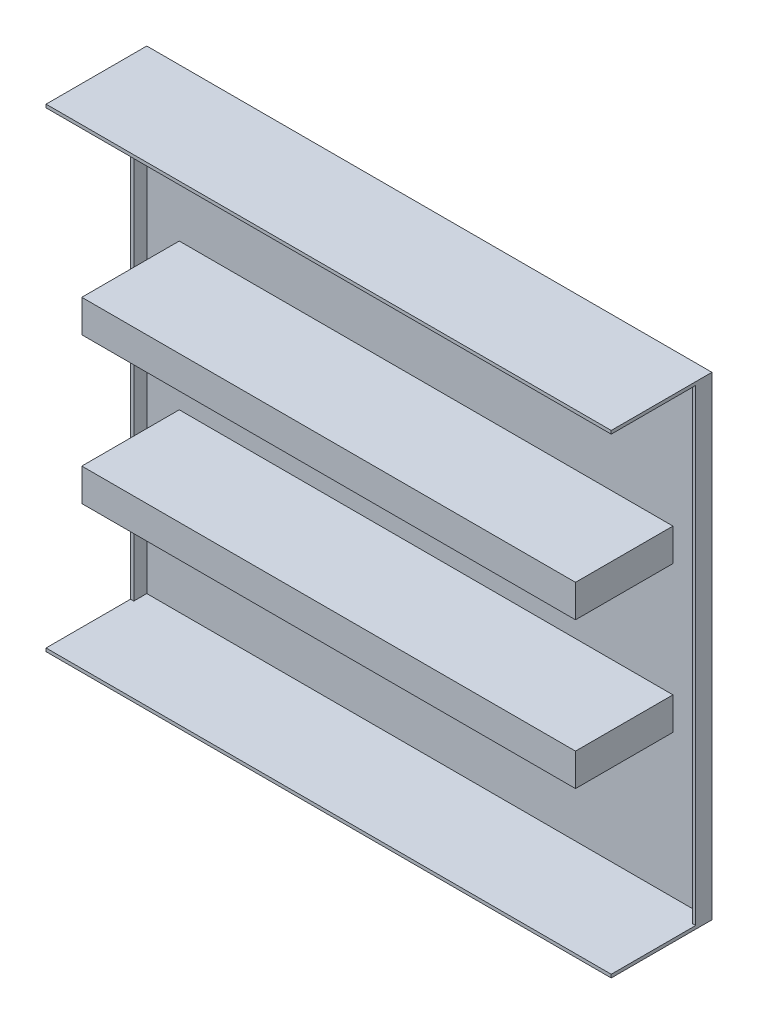
ISO-10303-21;
HEADER;
FILE_DESCRIPTION(('STEP AP214'),'2;1');
FILE_NAME('part.step','',(''),(''),'','','');
FILE_SCHEMA(('AUTOMOTIVE_DESIGN { 1 0 10303 214 1 1 1 1 }'));
ENDSEC;
DATA;
#1=APPLICATION_CONTEXT('core data for automotive mechanical design processes');
#2=APPLICATION_PROTOCOL_DEFINITION('international standard','automotive_design',2000,#1);
#3=PRODUCT_CONTEXT('',#1,'mechanical');
#4=PRODUCT('Part','Part','',(#3));
#5=PRODUCT_RELATED_PRODUCT_CATEGORY('part','',(#4));
#6=PRODUCT_DEFINITION_FORMATION('','',#4);
#7=PRODUCT_DEFINITION_CONTEXT('part definition',#1,'design');
#8=PRODUCT_DEFINITION('design','',#6,#7);
#9=PRODUCT_DEFINITION_SHAPE('','',#8);
#10=(LENGTH_UNIT() NAMED_UNIT(*) SI_UNIT(.MILLI.,.METRE.));
#11=(NAMED_UNIT(*) PLANE_ANGLE_UNIT() SI_UNIT($,.RADIAN.));
#12=(NAMED_UNIT(*) SI_UNIT($,.STERADIAN.) SOLID_ANGLE_UNIT());
#13=UNCERTAINTY_MEASURE_WITH_UNIT(LENGTH_MEASURE(1.E-05),#10,'distance_accuracy_value','');
#14=(GEOMETRIC_REPRESENTATION_CONTEXT(3) GLOBAL_UNCERTAINTY_ASSIGNED_CONTEXT((#13)) GLOBAL_UNIT_ASSIGNED_CONTEXT((#10,
#11,#12)) REPRESENTATION_CONTEXT('',''));
#15=CARTESIAN_POINT('',(0.,0.,0.));
#16=DIRECTION('',(0.,0.,1.));
#17=DIRECTION('',(1.,0.,0.));
#18=AXIS2_PLACEMENT_3D('',#15,#16,#17);
#19=CARTESIAN_POINT('',(0.,0.,5.));
#20=DIRECTION('',(0.,0.,1.));
#21=DIRECTION('',(1.,0.,0.));
#22=AXIS2_PLACEMENT_3D('',#19,#20,#21);
#23=PLANE('',#22);
#24=DIRECTION('',(0.,-1.,0.));
#25=VECTOR('',#24,1.);
#26=CARTESIAN_POINT('',(173.,145.,5.));
#27=LINE('',#26,#25);
#28=CARTESIAN_POINT('',(173.,144.,5.));
#29=VERTEX_POINT('',#28);
#30=CARTESIAN_POINT('',(173.,0.,5.));
#31=VERTEX_POINT('',#30);
#32=EDGE_CURVE('E87',#29,#31,#27,.T.);
#33=ORIENTED_EDGE('',*,*,#32,.F.);
#34=DIRECTION('',(-1.,0.,0.));
#35=VECTOR('',#34,1.);
#36=CARTESIAN_POINT('',(0.,144.,5.));
#37=LINE('',#36,#35);
#38=CARTESIAN_POINT('',(172.,144.,5.));
#39=VERTEX_POINT('',#38);
#40=EDGE_CURVE('E12',#29,#39,#37,.T.);
#41=ORIENTED_EDGE('',*,*,#40,.T.);
#42=DIRECTION('',(0.,1.,0.));
#43=VECTOR('',#42,1.);
#44=CARTESIAN_POINT('',(172.,0.,5.));
#45=LINE('',#44,#43);
#46=CARTESIAN_POINT('',(172.,0.,5.));
#47=VERTEX_POINT('',#46);
#48=EDGE_CURVE('E425',#47,#39,#45,.T.);
#49=ORIENTED_EDGE('',*,*,#48,.F.);
#50=DIRECTION('',(-1.,0.,0.));
#51=VECTOR('',#50,1.);
#52=CARTESIAN_POINT('',(-1.,0.,5.));
#53=LINE('',#52,#51);
#54=EDGE_CURVE('E229',#31,#47,#53,.T.);
#55=ORIENTED_EDGE('',*,*,#54,.F.);
#56=EDGE_LOOP('',(#33,#41,#49,#55));
#57=FACE_BOUND('',#56,.T.);
#58=ADVANCED_FACE('F71',(#57),#23,.T.);
#59=DIRECTION('',(0.,1.,0.));
#60=VECTOR('',#59,1.);
#61=CARTESIAN_POINT('',(0.,0.,5.));
#62=LINE('',#61,#60);
#63=CARTESIAN_POINT('',(0.,0.,5.));
#64=VERTEX_POINT('',#63);
#65=CARTESIAN_POINT('',(0.,144.,5.));
#66=VERTEX_POINT('',#65);
#67=EDGE_CURVE('E421',#64,#66,#62,.T.);
#68=ORIENTED_EDGE('',*,*,#67,.T.);
#69=DIRECTION('',(1.,0.,0.));
#70=VECTOR('',#69,1.);
#71=CARTESIAN_POINT('',(-1.,144.,5.));
#72=LINE('',#71,#70);
#73=CARTESIAN_POINT('',(-1.,144.,5.));
#74=VERTEX_POINT('',#73);
#75=EDGE_CURVE('E293',#74,#66,#72,.T.);
#76=ORIENTED_EDGE('',*,*,#75,.F.);
#77=DIRECTION('',(0.,-1.,0.));
#78=VECTOR('',#77,1.);
#79=CARTESIAN_POINT('',(-1.,145.,5.));
#80=LINE('',#79,#78);
#81=CARTESIAN_POINT('',(-1.,0.,5.));
#82=VERTEX_POINT('',#81);
#83=EDGE_CURVE('E233',#74,#82,#80,.T.);
#84=ORIENTED_EDGE('',*,*,#83,.T.);
#85=EDGE_CURVE('E80',#64,#82,#53,.T.);
#86=ORIENTED_EDGE('',*,*,#85,.F.);
#87=EDGE_LOOP('',(#68,#76,#84,#86));
#88=FACE_BOUND('',#87,.T.);
#89=ADVANCED_FACE('F441',(#88),#23,.T.);
#90=CARTESIAN_POINT('',(0.,0.,1.));
#91=DIRECTION('',(0.,0.,-1.));
#92=DIRECTION('',(-1.,0.,0.));
#93=AXIS2_PLACEMENT_3D('',#90,#91,#92);
#94=PLANE('',#93);
#95=DIRECTION('',(0.,1.,0.));
#96=VECTOR('',#95,1.);
#97=CARTESIAN_POINT('',(10.,44.,1.));
#98=LINE('',#97,#96);
#99=CARTESIAN_POINT('',(10.,44.,1.));
#100=VERTEX_POINT('',#99);
#101=CARTESIAN_POINT('',(10.,54.,1.));
#102=VERTEX_POINT('',#101);
#103=EDGE_CURVE('E95',#100,#102,#98,.T.);
#104=ORIENTED_EDGE('',*,*,#103,.T.);
#105=DIRECTION('',(1.,0.,0.));
#106=VECTOR('',#105,1.);
#107=CARTESIAN_POINT('',(10.,54.,1.));
#108=LINE('',#107,#106);
#109=CARTESIAN_POINT('',(162.,54.,1.));
#110=VERTEX_POINT('',#109);
#111=EDGE_CURVE('E362',#102,#110,#108,.T.);
#112=ORIENTED_EDGE('',*,*,#111,.T.);
#113=DIRECTION('',(0.,1.,0.));
#114=VECTOR('',#113,1.);
#115=CARTESIAN_POINT('',(162.,44.,1.));
#116=LINE('',#115,#114);
#117=CARTESIAN_POINT('',(162.,44.,1.));
#118=VERTEX_POINT('',#117);
#119=EDGE_CURVE('E358',#118,#110,#116,.T.);
#120=ORIENTED_EDGE('',*,*,#119,.F.);
#121=DIRECTION('',(1.,0.,0.));
#122=VECTOR('',#121,1.);
#123=CARTESIAN_POINT('',(10.,44.,1.));
#124=LINE('',#123,#122);
#125=EDGE_CURVE('E353',#100,#118,#124,.T.);
#126=ORIENTED_EDGE('',*,*,#125,.F.);
#127=EDGE_LOOP('',(#104,#112,#120,#126));
#128=FACE_BOUND('',#127,.T.);
#129=DIRECTION('',(1.,0.,0.));
#130=VECTOR('',#129,1.);
#131=CARTESIAN_POINT('',(0.,99.,1.));
#132=LINE('',#131,#130);
#133=CARTESIAN_POINT('',(10.,99.,1.));
#134=VERTEX_POINT('',#133);
#135=CARTESIAN_POINT('',(162.,99.,1.));
#136=VERTEX_POINT('',#135);
#137=EDGE_CURVE('E396',#134,#136,#132,.T.);
#138=ORIENTED_EDGE('',*,*,#137,.T.);
#139=DIRECTION('',(0.,-1.,0.));
#140=VECTOR('',#139,1.);
#141=CARTESIAN_POINT('',(162.,0.,1.));
#142=LINE('',#141,#140);
#143=CARTESIAN_POINT('',(162.,89.,1.));
#144=VERTEX_POINT('',#143);
#145=EDGE_CURVE('E365',#136,#144,#142,.T.);
#146=ORIENTED_EDGE('',*,*,#145,.T.);
#147=DIRECTION('',(1.,0.,0.));
#148=VECTOR('',#147,1.);
#149=CARTESIAN_POINT('',(0.,89.,1.));
#150=LINE('',#149,#148);
#151=CARTESIAN_POINT('',(10.,89.,1.));
#152=VERTEX_POINT('',#151);
#153=EDGE_CURVE('E383',#152,#144,#150,.T.);
#154=ORIENTED_EDGE('',*,*,#153,.F.);
#155=DIRECTION('',(0.,-1.,0.));
#156=VECTOR('',#155,1.);
#157=CARTESIAN_POINT('',(10.,0.,1.));
#158=LINE('',#157,#156);
#159=EDGE_CURVE('E399',#134,#152,#158,.T.);
#160=ORIENTED_EDGE('',*,*,#159,.F.);
#161=EDGE_LOOP('',(#138,#146,#154,#160));
#162=FACE_BOUND('',#161,.T.);
#163=DIRECTION('',(0.,1.,0.));
#164=VECTOR('',#163,1.);
#165=CARTESIAN_POINT('',(0.,0.,1.));
#166=LINE('',#165,#164);
#167=CARTESIAN_POINT('',(0.,0.,1.));
#168=VERTEX_POINT('',#167);
#169=CARTESIAN_POINT('',(0.,144.,1.));
#170=VERTEX_POINT('',#169);
#171=EDGE_CURVE('E268',#168,#170,#166,.T.);
#172=ORIENTED_EDGE('',*,*,#171,.F.);
#173=DIRECTION('',(1.,0.,0.));
#174=VECTOR('',#173,1.);
#175=CARTESIAN_POINT('',(0.,0.,1.));
#176=LINE('',#175,#174);
#177=CARTESIAN_POINT('',(172.,0.,1.));
#178=VERTEX_POINT('',#177);
#179=EDGE_CURVE('E277',#168,#178,#176,.T.);
#180=ORIENTED_EDGE('',*,*,#179,.T.);
#181=DIRECTION('',(0.,1.,0.));
#182=VECTOR('',#181,1.);
#183=CARTESIAN_POINT('',(172.,0.,1.));
#184=LINE('',#183,#182);
#185=CARTESIAN_POINT('',(172.,144.,1.));
#186=VERTEX_POINT('',#185);
#187=EDGE_CURVE('E275',#178,#186,#184,.T.);
#188=ORIENTED_EDGE('',*,*,#187,.T.);
#189=DIRECTION('',(1.,0.,0.));
#190=VECTOR('',#189,1.);
#191=CARTESIAN_POINT('',(0.,144.,1.));
#192=LINE('',#191,#190);
#193=EDGE_CURVE('E272',#170,#186,#192,.T.);
#194=ORIENTED_EDGE('',*,*,#193,.F.);
#195=EDGE_LOOP('',(#172,#180,#188,#194));
#196=FACE_BOUND('',#195,.T.);
#197=ADVANCED_FACE('F445',(#128,#162,#196),#94,.F.);
#198=CARTESIAN_POINT('',(0.,0.,5.));
#199=DIRECTION('',(-1.,0.,0.));
#200=DIRECTION('',(0.,0.,1.));
#201=AXIS2_PLACEMENT_3D('',#198,#199,#200);
#202=PLANE('',#201);
#203=DIRECTION('',(0.,0.,-1.));
#204=VECTOR('',#203,1.);
#205=CARTESIAN_POINT('',(0.,0.,5.));
#206=LINE('',#205,#204);
#207=EDGE_CURVE('E248',#64,#168,#206,.T.);
#208=ORIENTED_EDGE('',*,*,#207,.T.);
#209=ORIENTED_EDGE('',*,*,#171,.T.);
#210=DIRECTION('',(0.,0.,-1.));
#211=VECTOR('',#210,1.);
#212=CARTESIAN_POINT('',(0.,144.,5.));
#213=LINE('',#212,#211);
#214=EDGE_CURVE('E428',#66,#170,#213,.T.);
#215=ORIENTED_EDGE('',*,*,#214,.F.);
#216=ORIENTED_EDGE('',*,*,#67,.F.);
#217=EDGE_LOOP('',(#208,#209,#215,#216));
#218=FACE_BOUND('',#217,.T.);
#219=ADVANCED_FACE('F439',(#218),#202,.F.);
#220=CARTESIAN_POINT('',(0.,0.,5.));
#221=DIRECTION('',(0.,1.,0.));
#222=DIRECTION('',(0.,0.,1.));
#223=AXIS2_PLACEMENT_3D('',#220,#221,#222);
#224=PLANE('',#223);
#225=ORIENTED_EDGE('',*,*,#179,.F.);
#226=ORIENTED_EDGE('',*,*,#207,.F.);
#227=ORIENTED_EDGE('',*,*,#85,.T.);
#228=DIRECTION('',(0.,0.,-1.));
#229=VECTOR('',#228,1.);
#230=CARTESIAN_POINT('',(-1.,0.,31.));
#231=LINE('',#230,#229);
#232=CARTESIAN_POINT('',(-1.,0.,31.));
#233=VERTEX_POINT('',#232);
#234=EDGE_CURVE('E324',#233,#82,#231,.T.);
#235=ORIENTED_EDGE('',*,*,#234,.F.);
#236=DIRECTION('',(-1.,0.,0.));
#237=VECTOR('',#236,1.);
#238=CARTESIAN_POINT('',(-1.,0.,31.));
#239=LINE('',#238,#237);
#240=CARTESIAN_POINT('',(173.,0.,31.));
#241=VERTEX_POINT('',#240);
#242=EDGE_CURVE('E322',#241,#233,#239,.T.);
#243=ORIENTED_EDGE('',*,*,#242,.F.);
#244=DIRECTION('',(0.,0.,-1.));
#245=VECTOR('',#244,1.);
#246=CARTESIAN_POINT('',(173.,0.,31.));
#247=LINE('',#246,#245);
#248=EDGE_CURVE('E328',#241,#31,#247,.T.);
#249=ORIENTED_EDGE('',*,*,#248,.T.);
#250=ORIENTED_EDGE('',*,*,#54,.T.);
#251=DIRECTION('',(0.,0.,-1.));
#252=VECTOR('',#251,1.);
#253=CARTESIAN_POINT('',(172.,0.,5.));
#254=LINE('',#253,#252);
#255=EDGE_CURVE('E432',#47,#178,#254,.T.);
#256=ORIENTED_EDGE('',*,*,#255,.T.);
#257=EDGE_LOOP('',(#225,#226,#227,#235,#243,#249,#250,#256));
#258=FACE_BOUND('',#257,.T.);
#259=ADVANCED_FACE('F442',(#258),#224,.T.);
#260=CARTESIAN_POINT('',(172.,0.,5.));
#261=DIRECTION('',(-1.,0.,0.));
#262=DIRECTION('',(0.,0.,1.));
#263=AXIS2_PLACEMENT_3D('',#260,#261,#262);
#264=PLANE('',#263);
#265=ORIENTED_EDGE('',*,*,#187,.F.);
#266=ORIENTED_EDGE('',*,*,#255,.F.);
#267=ORIENTED_EDGE('',*,*,#48,.T.);
#268=DIRECTION('',(0.,0.,-1.));
#269=VECTOR('',#268,1.);
#270=CARTESIAN_POINT('',(172.,144.,5.));
#271=LINE('',#270,#269);
#272=EDGE_CURVE('E216',#39,#186,#271,.T.);
#273=ORIENTED_EDGE('',*,*,#272,.T.);
#274=EDGE_LOOP('',(#265,#266,#267,#273));
#275=FACE_BOUND('',#274,.T.);
#276=ADVANCED_FACE('F444',(#275),#264,.T.);
#277=CARTESIAN_POINT('',(0.,144.,5.));
#278=DIRECTION('',(0.,1.,0.));
#279=DIRECTION('',(0.,0.,1.));
#280=AXIS2_PLACEMENT_3D('',#277,#278,#279);
#281=PLANE('',#280);
#282=ORIENTED_EDGE('',*,*,#214,.T.);
#283=ORIENTED_EDGE('',*,*,#193,.T.);
#284=ORIENTED_EDGE('',*,*,#272,.F.);
#285=ORIENTED_EDGE('',*,*,#40,.F.);
#286=DIRECTION('',(0.,0.,-1.));
#287=VECTOR('',#286,1.);
#288=CARTESIAN_POINT('',(173.,144.,31.));
#289=LINE('',#288,#287);
#290=CARTESIAN_POINT('',(173.,144.,31.));
#291=VERTEX_POINT('',#290);
#292=EDGE_CURVE('E212',#291,#29,#289,.T.);
#293=ORIENTED_EDGE('',*,*,#292,.F.);
#294=DIRECTION('',(1.,0.,0.));
#295=VECTOR('',#294,1.);
#296=CARTESIAN_POINT('',(-1.,144.,31.));
#297=LINE('',#296,#295);
#298=CARTESIAN_POINT('',(-1.,144.,31.));
#299=VERTEX_POINT('',#298);
#300=EDGE_CURVE('E306',#299,#291,#297,.T.);
#301=ORIENTED_EDGE('',*,*,#300,.F.);
#302=DIRECTION('',(0.,0.,-1.));
#303=VECTOR('',#302,1.);
#304=CARTESIAN_POINT('',(-1.,144.,31.));
#305=LINE('',#304,#303);
#306=EDGE_CURVE('E226',#299,#74,#305,.T.);
#307=ORIENTED_EDGE('',*,*,#306,.T.);
#308=ORIENTED_EDGE('',*,*,#75,.T.);
#309=EDGE_LOOP('',(#282,#283,#284,#285,#293,#301,#307,#308));
#310=FACE_BOUND('',#309,.T.);
#311=ADVANCED_FACE('F211',(#310),#281,.F.);
#312=CARTESIAN_POINT('',(-1.,145.,5.));
#313=DIRECTION('',(1.,0.,0.));
#314=DIRECTION('',(0.,0.,-1.));
#315=AXIS2_PLACEMENT_3D('',#312,#313,#314);
#316=PLANE('',#315);
#317=DIRECTION('',(0.,-1.,0.));
#318=VECTOR('',#317,1.);
#319=CARTESIAN_POINT('',(-1.,145.,0.));
#320=LINE('',#319,#318);
#321=CARTESIAN_POINT('',(-1.,145.,0.));
#322=VERTEX_POINT('',#321);
#323=CARTESIAN_POINT('',(-1.,-1.,0.));
#324=VERTEX_POINT('',#323);
#325=EDGE_CURVE('E243',#322,#324,#320,.T.);
#326=ORIENTED_EDGE('',*,*,#325,.T.);
#327=DIRECTION('',(0.,0.,-1.));
#328=VECTOR('',#327,1.);
#329=CARTESIAN_POINT('',(-1.,-1.,5.));
#330=LINE('',#329,#328);
#331=CARTESIAN_POINT('',(-1.,-1.,31.));
#332=VERTEX_POINT('',#331);
#333=EDGE_CURVE('E264',#332,#324,#330,.T.);
#334=ORIENTED_EDGE('',*,*,#333,.F.);
#335=DIRECTION('',(0.,-1.,0.));
#336=VECTOR('',#335,1.);
#337=CARTESIAN_POINT('',(-1.,-1.,31.));
#338=LINE('',#337,#336);
#339=EDGE_CURVE('E292',#233,#332,#338,.T.);
#340=ORIENTED_EDGE('',*,*,#339,.F.);
#341=ORIENTED_EDGE('',*,*,#234,.T.);
#342=ORIENTED_EDGE('',*,*,#83,.F.);
#343=ORIENTED_EDGE('',*,*,#306,.F.);
#344=DIRECTION('',(0.,-1.,0.));
#345=VECTOR('',#344,1.);
#346=CARTESIAN_POINT('',(-1.,145.,31.));
#347=LINE('',#346,#345);
#348=CARTESIAN_POINT('',(-1.,145.,31.));
#349=VERTEX_POINT('',#348);
#350=EDGE_CURVE('E300',#349,#299,#347,.T.);
#351=ORIENTED_EDGE('',*,*,#350,.F.);
#352=DIRECTION('',(0.,0.,-1.));
#353=VECTOR('',#352,1.);
#354=CARTESIAN_POINT('',(-1.,145.,5.));
#355=LINE('',#354,#353);
#356=EDGE_CURVE('E232',#349,#322,#355,.T.);
#357=ORIENTED_EDGE('',*,*,#356,.T.);
#358=EDGE_LOOP('',(#326,#334,#340,#341,#342,#343,#351,#357));
#359=FACE_BOUND('',#358,.T.);
#360=ADVANCED_FACE('F471',(#359),#316,.F.);
#361=CARTESIAN_POINT('',(-1.,-1.,5.));
#362=DIRECTION('',(0.,1.,0.));
#363=DIRECTION('',(0.,0.,1.));
#364=AXIS2_PLACEMENT_3D('',#361,#362,#363);
#365=PLANE('',#364);
#366=DIRECTION('',(1.,0.,0.));
#367=VECTOR('',#366,1.);
#368=CARTESIAN_POINT('',(-1.,-1.,0.));
#369=LINE('',#368,#367);
#370=CARTESIAN_POINT('',(173.,-1.,0.));
#371=VERTEX_POINT('',#370);
#372=EDGE_CURVE('E247',#324,#371,#369,.T.);
#373=ORIENTED_EDGE('',*,*,#372,.T.);
#374=DIRECTION('',(0.,0.,-1.));
#375=VECTOR('',#374,1.);
#376=CARTESIAN_POINT('',(173.,-1.,5.));
#377=LINE('',#376,#375);
#378=CARTESIAN_POINT('',(173.,-1.,31.));
#379=VERTEX_POINT('',#378);
#380=EDGE_CURVE('E261',#379,#371,#377,.T.);
#381=ORIENTED_EDGE('',*,*,#380,.F.);
#382=DIRECTION('',(1.,0.,0.));
#383=VECTOR('',#382,1.);
#384=CARTESIAN_POINT('',(-1.,-1.,31.));
#385=LINE('',#384,#383);
#386=EDGE_CURVE('E298',#332,#379,#385,.T.);
#387=ORIENTED_EDGE('',*,*,#386,.F.);
#388=ORIENTED_EDGE('',*,*,#333,.T.);
#389=EDGE_LOOP('',(#373,#381,#387,#388));
#390=FACE_BOUND('',#389,.T.);
#391=ADVANCED_FACE('F469',(#390),#365,.F.);
#392=CARTESIAN_POINT('',(173.,145.,5.));
#393=DIRECTION('',(1.,0.,0.));
#394=DIRECTION('',(0.,0.,-1.));
#395=AXIS2_PLACEMENT_3D('',#392,#393,#394);
#396=PLANE('',#395);
#397=DIRECTION('',(0.,-1.,0.));
#398=VECTOR('',#397,1.);
#399=CARTESIAN_POINT('',(173.,145.,0.));
#400=LINE('',#399,#398);
#401=CARTESIAN_POINT('',(173.,145.,0.));
#402=VERTEX_POINT('',#401);
#403=EDGE_CURVE('E252',#402,#371,#400,.T.);
#404=ORIENTED_EDGE('',*,*,#403,.F.);
#405=DIRECTION('',(0.,0.,-1.));
#406=VECTOR('',#405,1.);
#407=CARTESIAN_POINT('',(173.,145.,5.));
#408=LINE('',#407,#406);
#409=CARTESIAN_POINT('',(173.,145.,31.));
#410=VERTEX_POINT('',#409);
#411=EDGE_CURVE('E237',#410,#402,#408,.T.);
#412=ORIENTED_EDGE('',*,*,#411,.F.);
#413=DIRECTION('',(0.,1.,0.));
#414=VECTOR('',#413,1.);
#415=CARTESIAN_POINT('',(173.,145.,31.));
#416=LINE('',#415,#414);
#417=EDGE_CURVE('E223',#291,#410,#416,.T.);
#418=ORIENTED_EDGE('',*,*,#417,.F.);
#419=ORIENTED_EDGE('',*,*,#292,.T.);
#420=ORIENTED_EDGE('',*,*,#32,.T.);
#421=ORIENTED_EDGE('',*,*,#248,.F.);
#422=DIRECTION('',(0.,1.,0.));
#423=VECTOR('',#422,1.);
#424=CARTESIAN_POINT('',(173.,-1.,31.));
#425=LINE('',#424,#423);
#426=EDGE_CURVE('E320',#379,#241,#425,.T.);
#427=ORIENTED_EDGE('',*,*,#426,.F.);
#428=ORIENTED_EDGE('',*,*,#380,.T.);
#429=EDGE_LOOP('',(#404,#412,#418,#419,#420,#421,#427,#428));
#430=FACE_BOUND('',#429,.T.);
#431=ADVANCED_FACE('F221',(#430),#396,.T.);
#432=CARTESIAN_POINT('',(-1.,145.,5.));
#433=DIRECTION('',(0.,1.,0.));
#434=DIRECTION('',(0.,0.,1.));
#435=AXIS2_PLACEMENT_3D('',#432,#433,#434);
#436=PLANE('',#435);
#437=DIRECTION('',(1.,0.,0.));
#438=VECTOR('',#437,1.);
#439=CARTESIAN_POINT('',(-1.,145.,0.));
#440=LINE('',#439,#438);
#441=EDGE_CURVE('E239',#322,#402,#440,.T.);
#442=ORIENTED_EDGE('',*,*,#441,.F.);
#443=ORIENTED_EDGE('',*,*,#356,.F.);
#444=DIRECTION('',(-1.,0.,0.));
#445=VECTOR('',#444,1.);
#446=CARTESIAN_POINT('',(-1.,145.,31.));
#447=LINE('',#446,#445);
#448=EDGE_CURVE('E225',#410,#349,#447,.T.);
#449=ORIENTED_EDGE('',*,*,#448,.F.);
#450=ORIENTED_EDGE('',*,*,#411,.T.);
#451=EDGE_LOOP('',(#442,#443,#449,#450));
#452=FACE_BOUND('',#451,.T.);
#453=ADVANCED_FACE('F463',(#452),#436,.T.);
#454=CARTESIAN_POINT('',(0.,0.,0.));
#455=DIRECTION('',(0.,0.,-1.));
#456=DIRECTION('',(-1.,0.,0.));
#457=AXIS2_PLACEMENT_3D('',#454,#455,#456);
#458=PLANE('',#457);
#459=ORIENTED_EDGE('',*,*,#325,.F.);
#460=ORIENTED_EDGE('',*,*,#441,.T.);
#461=ORIENTED_EDGE('',*,*,#403,.T.);
#462=ORIENTED_EDGE('',*,*,#372,.F.);
#463=EDGE_LOOP('',(#459,#460,#461,#462));
#464=FACE_BOUND('',#463,.T.);
#465=ADVANCED_FACE('F73',(#464),#458,.T.);
#466=CARTESIAN_POINT('',(162.,0.,31.));
#467=DIRECTION('',(1.,0.,0.));
#468=DIRECTION('',(0.,0.,-1.));
#469=AXIS2_PLACEMENT_3D('',#466,#467,#468);
#470=PLANE('',#469);
#471=ORIENTED_EDGE('',*,*,#145,.F.);
#472=DIRECTION('',(0.,0.,-1.));
#473=VECTOR('',#472,1.);
#474=CARTESIAN_POINT('',(162.,99.,31.));
#475=LINE('',#474,#473);
#476=CARTESIAN_POINT('',(162.,99.,31.));
#477=VERTEX_POINT('',#476);
#478=EDGE_CURVE('E417',#477,#136,#475,.T.);
#479=ORIENTED_EDGE('',*,*,#478,.F.);
#480=DIRECTION('',(0.,-1.,0.));
#481=VECTOR('',#480,1.);
#482=CARTESIAN_POINT('',(162.,0.,31.));
#483=LINE('',#482,#481);
#484=CARTESIAN_POINT('',(162.,89.,31.));
#485=VERTEX_POINT('',#484);
#486=EDGE_CURVE('E378',#477,#485,#483,.T.);
#487=ORIENTED_EDGE('',*,*,#486,.T.);
#488=DIRECTION('',(0.,0.,-1.));
#489=VECTOR('',#488,1.);
#490=CARTESIAN_POINT('',(162.,89.,31.));
#491=LINE('',#490,#489);
#492=EDGE_CURVE('E393',#485,#144,#491,.T.);
#493=ORIENTED_EDGE('',*,*,#492,.T.);
#494=EDGE_LOOP('',(#471,#479,#487,#493));
#495=FACE_BOUND('',#494,.T.);
#496=ADVANCED_FACE('F528',(#495),#470,.T.);
#497=CARTESIAN_POINT('',(0.,99.,31.));
#498=DIRECTION('',(0.,1.,0.));
#499=DIRECTION('',(0.,0.,1.));
#500=AXIS2_PLACEMENT_3D('',#497,#498,#499);
#501=PLANE('',#500);
#502=ORIENTED_EDGE('',*,*,#137,.F.);
#503=DIRECTION('',(0.,0.,-1.));
#504=VECTOR('',#503,1.);
#505=CARTESIAN_POINT('',(10.,99.,31.));
#506=LINE('',#505,#504);
#507=CARTESIAN_POINT('',(10.,99.,31.));
#508=VERTEX_POINT('',#507);
#509=EDGE_CURVE('E413',#508,#134,#506,.T.);
#510=ORIENTED_EDGE('',*,*,#509,.F.);
#511=DIRECTION('',(1.,0.,0.));
#512=VECTOR('',#511,1.);
#513=CARTESIAN_POINT('',(0.,99.,31.));
#514=LINE('',#513,#512);
#515=EDGE_CURVE('E382',#508,#477,#514,.T.);
#516=ORIENTED_EDGE('',*,*,#515,.T.);
#517=ORIENTED_EDGE('',*,*,#478,.T.);
#518=EDGE_LOOP('',(#502,#510,#516,#517));
#519=FACE_BOUND('',#518,.T.);
#520=ADVANCED_FACE('F524',(#519),#501,.T.);
#521=CARTESIAN_POINT('',(10.,0.,31.));
#522=DIRECTION('',(1.,0.,0.));
#523=DIRECTION('',(0.,1.,0.));
#524=AXIS2_PLACEMENT_3D('',#521,#522,#523);
#525=PLANE('',#524);
#526=ORIENTED_EDGE('',*,*,#159,.T.);
#527=DIRECTION('',(0.,0.,-1.));
#528=VECTOR('',#527,1.);
#529=CARTESIAN_POINT('',(10.,89.,31.));
#530=LINE('',#529,#528);
#531=CARTESIAN_POINT('',(10.,89.,31.));
#532=VERTEX_POINT('',#531);
#533=EDGE_CURVE('E409',#532,#152,#530,.T.);
#534=ORIENTED_EDGE('',*,*,#533,.F.);
#535=DIRECTION('',(0.,-1.,0.));
#536=VECTOR('',#535,1.);
#537=CARTESIAN_POINT('',(10.,0.,31.));
#538=LINE('',#537,#536);
#539=EDGE_CURVE('E387',#508,#532,#538,.T.);
#540=ORIENTED_EDGE('',*,*,#539,.F.);
#541=ORIENTED_EDGE('',*,*,#509,.T.);
#542=EDGE_LOOP('',(#526,#534,#540,#541));
#543=FACE_BOUND('',#542,.T.);
#544=ADVANCED_FACE('F520',(#543),#525,.F.);
#545=CARTESIAN_POINT('',(0.,89.,31.));
#546=DIRECTION('',(0.,1.,0.));
#547=DIRECTION('',(0.,0.,1.));
#548=AXIS2_PLACEMENT_3D('',#545,#546,#547);
#549=PLANE('',#548);
#550=ORIENTED_EDGE('',*,*,#153,.T.);
#551=ORIENTED_EDGE('',*,*,#492,.F.);
#552=DIRECTION('',(1.,0.,0.));
#553=VECTOR('',#552,1.);
#554=CARTESIAN_POINT('',(0.,89.,31.));
#555=LINE('',#554,#553);
#556=EDGE_CURVE('E390',#532,#485,#555,.T.);
#557=ORIENTED_EDGE('',*,*,#556,.F.);
#558=ORIENTED_EDGE('',*,*,#533,.T.);
#559=EDGE_LOOP('',(#550,#551,#557,#558));
#560=FACE_BOUND('',#559,.T.);
#561=ADVANCED_FACE('F516',(#560),#549,.F.);
#562=CARTESIAN_POINT('',(0.,0.,31.));
#563=DIRECTION('',(0.,0.,1.));
#564=DIRECTION('',(1.,0.,0.));
#565=AXIS2_PLACEMENT_3D('',#562,#563,#564);
#566=PLANE('',#565);
#567=ORIENTED_EDGE('',*,*,#486,.F.);
#568=ORIENTED_EDGE('',*,*,#515,.F.);
#569=ORIENTED_EDGE('',*,*,#539,.T.);
#570=ORIENTED_EDGE('',*,*,#556,.T.);
#571=EDGE_LOOP('',(#567,#568,#569,#570));
#572=FACE_BOUND('',#571,.T.);
#573=ADVANCED_FACE('F502',(#572),#566,.T.);
#574=CARTESIAN_POINT('',(10.,54.,31.));
#575=DIRECTION('',(0.,1.,0.));
#576=DIRECTION('',(0.,0.,1.));
#577=AXIS2_PLACEMENT_3D('',#574,#575,#576);
#578=PLANE('',#577);
#579=ORIENTED_EDGE('',*,*,#111,.F.);
#580=DIRECTION('',(0.,0.,-1.));
#581=VECTOR('',#580,1.);
#582=CARTESIAN_POINT('',(10.,54.,31.));
#583=LINE('',#582,#581);
#584=CARTESIAN_POINT('',(10.,54.,31.));
#585=VERTEX_POINT('',#584);
#586=EDGE_CURVE('E333',#585,#102,#583,.T.);
#587=ORIENTED_EDGE('',*,*,#586,.F.);
#588=DIRECTION('',(1.,0.,0.));
#589=VECTOR('',#588,1.);
#590=CARTESIAN_POINT('',(10.,54.,31.));
#591=LINE('',#590,#589);
#592=CARTESIAN_POINT('',(162.,54.,31.));
#593=VERTEX_POINT('',#592);
#594=EDGE_CURVE('E354',#585,#593,#591,.T.);
#595=ORIENTED_EDGE('',*,*,#594,.T.);
#596=DIRECTION('',(0.,0.,-1.));
#597=VECTOR('',#596,1.);
#598=CARTESIAN_POINT('',(162.,54.,31.));
#599=LINE('',#598,#597);
#600=EDGE_CURVE('E336',#593,#110,#599,.T.);
#601=ORIENTED_EDGE('',*,*,#600,.T.);
#602=EDGE_LOOP('',(#579,#587,#595,#601));
#603=FACE_BOUND('',#602,.T.);
#604=ADVANCED_FACE('F498',(#603),#578,.T.);
#605=CARTESIAN_POINT('',(10.,44.,31.));
#606=DIRECTION('',(-1.,0.,0.));
#607=DIRECTION('',(0.,0.,1.));
#608=AXIS2_PLACEMENT_3D('',#605,#606,#607);
#609=PLANE('',#608);
#610=ORIENTED_EDGE('',*,*,#103,.F.);
#611=DIRECTION('',(0.,0.,-1.));
#612=VECTOR('',#611,1.);
#613=CARTESIAN_POINT('',(10.,44.,31.));
#614=LINE('',#613,#612);
#615=CARTESIAN_POINT('',(10.,44.,31.));
#616=VERTEX_POINT('',#615);
#617=EDGE_CURVE('E345',#616,#100,#614,.T.);
#618=ORIENTED_EDGE('',*,*,#617,.F.);
#619=DIRECTION('',(0.,1.,0.));
#620=VECTOR('',#619,1.);
#621=CARTESIAN_POINT('',(10.,44.,31.));
#622=LINE('',#621,#620);
#623=EDGE_CURVE('E340',#616,#585,#622,.T.);
#624=ORIENTED_EDGE('',*,*,#623,.T.);
#625=ORIENTED_EDGE('',*,*,#586,.T.);
#626=EDGE_LOOP('',(#610,#618,#624,#625));
#627=FACE_BOUND('',#626,.T.);
#628=ADVANCED_FACE('F501',(#627),#609,.T.);
#629=CARTESIAN_POINT('',(10.,44.,31.));
#630=DIRECTION('',(0.,1.,0.));
#631=DIRECTION('',(0.,0.,1.));
#632=AXIS2_PLACEMENT_3D('',#629,#630,#631);
#633=PLANE('',#632);
#634=ORIENTED_EDGE('',*,*,#125,.T.);
#635=DIRECTION('',(0.,0.,-1.));
#636=VECTOR('',#635,1.);
#637=CARTESIAN_POINT('',(162.,44.,31.));
#638=LINE('',#637,#636);
#639=CARTESIAN_POINT('',(162.,44.,31.));
#640=VERTEX_POINT('',#639);
#641=EDGE_CURVE('E341',#640,#118,#638,.T.);
#642=ORIENTED_EDGE('',*,*,#641,.F.);
#643=DIRECTION('',(1.,0.,0.));
#644=VECTOR('',#643,1.);
#645=CARTESIAN_POINT('',(10.,44.,31.));
#646=LINE('',#645,#644);
#647=EDGE_CURVE('E369',#616,#640,#646,.T.);
#648=ORIENTED_EDGE('',*,*,#647,.F.);
#649=ORIENTED_EDGE('',*,*,#617,.T.);
#650=EDGE_LOOP('',(#634,#642,#648,#649));
#651=FACE_BOUND('',#650,.T.);
#652=ADVANCED_FACE('F506',(#651),#633,.F.);
#653=CARTESIAN_POINT('',(162.,44.,31.));
#654=DIRECTION('',(-1.,0.,0.));
#655=DIRECTION('',(0.,0.,1.));
#656=AXIS2_PLACEMENT_3D('',#653,#654,#655);
#657=PLANE('',#656);
#658=ORIENTED_EDGE('',*,*,#119,.T.);
#659=ORIENTED_EDGE('',*,*,#600,.F.);
#660=DIRECTION('',(0.,1.,0.));
#661=VECTOR('',#660,1.);
#662=CARTESIAN_POINT('',(162.,44.,31.));
#663=LINE('',#662,#661);
#664=EDGE_CURVE('E372',#640,#593,#663,.T.);
#665=ORIENTED_EDGE('',*,*,#664,.F.);
#666=ORIENTED_EDGE('',*,*,#641,.T.);
#667=EDGE_LOOP('',(#658,#659,#665,#666));
#668=FACE_BOUND('',#667,.T.);
#669=ADVANCED_FACE('F494',(#668),#657,.F.);
#670=CARTESIAN_POINT('',(0.,0.,31.));
#671=DIRECTION('',(0.,0.,1.));
#672=DIRECTION('',(1.,0.,0.));
#673=AXIS2_PLACEMENT_3D('',#670,#671,#672);
#674=PLANE('',#673);
#675=ORIENTED_EDGE('',*,*,#594,.F.);
#676=ORIENTED_EDGE('',*,*,#623,.F.);
#677=ORIENTED_EDGE('',*,*,#647,.T.);
#678=ORIENTED_EDGE('',*,*,#664,.T.);
#679=EDGE_LOOP('',(#675,#676,#677,#678));
#680=FACE_BOUND('',#679,.T.);
#681=ADVANCED_FACE('F487',(#680),#674,.T.);
#682=CARTESIAN_POINT('',(0.,0.,31.));
#683=DIRECTION('',(0.,0.,-1.));
#684=DIRECTION('',(-1.,0.,0.));
#685=AXIS2_PLACEMENT_3D('',#682,#683,#684);
#686=PLANE('',#685);
#687=ORIENTED_EDGE('',*,*,#339,.T.);
#688=ORIENTED_EDGE('',*,*,#386,.T.);
#689=ORIENTED_EDGE('',*,*,#426,.T.);
#690=ORIENTED_EDGE('',*,*,#242,.T.);
#691=EDGE_LOOP('',(#687,#688,#689,#690));
#692=FACE_BOUND('',#691,.T.);
#693=ADVANCED_FACE('F484',(#692),#686,.F.);
#694=CARTESIAN_POINT('',(0.,0.,31.));
#695=DIRECTION('',(0.,0.,1.));
#696=DIRECTION('',(1.,0.,0.));
#697=AXIS2_PLACEMENT_3D('',#694,#695,#696);
#698=PLANE('',#697);
#699=ORIENTED_EDGE('',*,*,#350,.T.);
#700=ORIENTED_EDGE('',*,*,#300,.T.);
#701=ORIENTED_EDGE('',*,*,#417,.T.);
#702=ORIENTED_EDGE('',*,*,#448,.T.);
#703=EDGE_LOOP('',(#699,#700,#701,#702));
#704=FACE_BOUND('',#703,.T.);
#705=ADVANCED_FACE('F486',(#704),#698,.T.);
#706=CLOSED_SHELL('',(#58,#89,#197,#219,#259,#276,#311,#360,#391,#431,#453,#465,#496,#520,#544,
#561,#573,#604,#628,#652,#669,#681,#693,#705));
#707=MANIFOLD_SOLID_BREP('B2',#706);
#708=ADVANCED_BREP_SHAPE_REPRESENTATION('',(#18,#707),#14);
#709=SHAPE_DEFINITION_REPRESENTATION(#9,#708);
ENDSEC;
END-ISO-10303-21;
